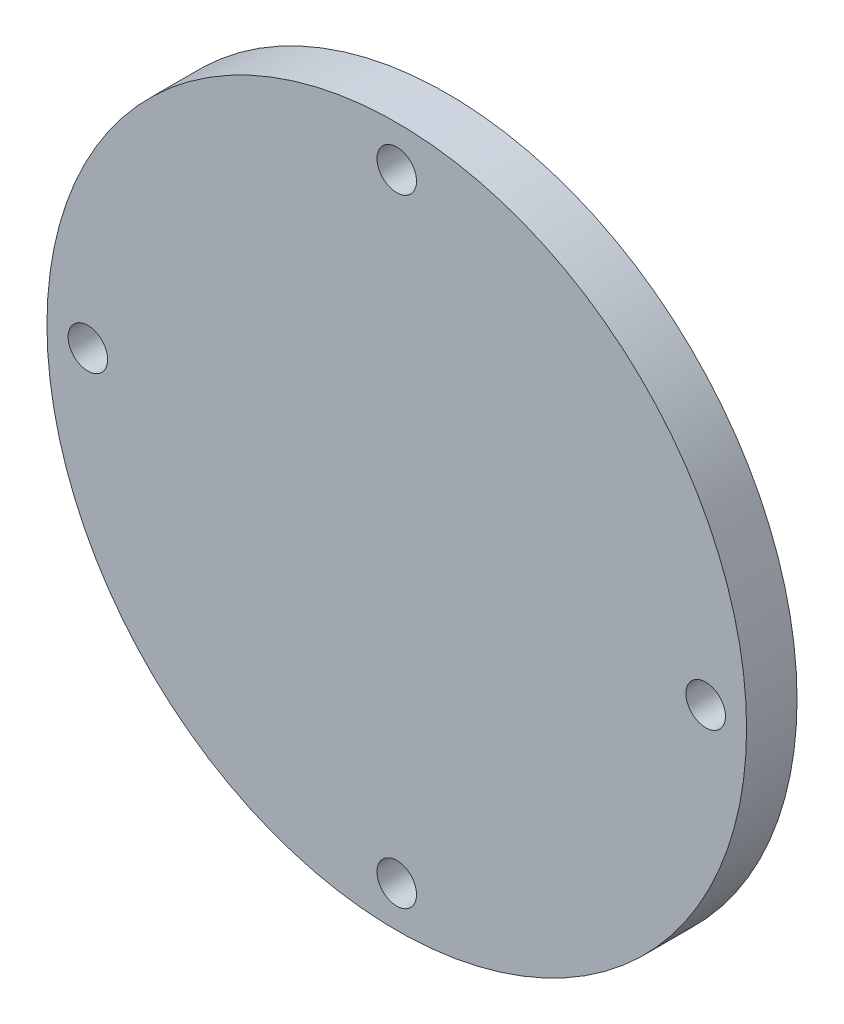
ISO-10303-21;
HEADER;
FILE_DESCRIPTION(('STEP AP214'),'2;1');
FILE_NAME('part.step','',(''),(''),'','','');
FILE_SCHEMA(('AUTOMOTIVE_DESIGN { 1 0 10303 214 1 1 1 1 }'));
ENDSEC;
DATA;
#1=APPLICATION_CONTEXT('core data for automotive mechanical design processes');
#2=APPLICATION_PROTOCOL_DEFINITION('international standard','automotive_design',2000,#1);
#3=PRODUCT_CONTEXT('',#1,'mechanical');
#4=PRODUCT('Part','Part','',(#3));
#5=PRODUCT_RELATED_PRODUCT_CATEGORY('part','',(#4));
#6=PRODUCT_DEFINITION_FORMATION('','',#4);
#7=PRODUCT_DEFINITION_CONTEXT('part definition',#1,'design');
#8=PRODUCT_DEFINITION('design','',#6,#7);
#9=PRODUCT_DEFINITION_SHAPE('','',#8);
#10=(LENGTH_UNIT() NAMED_UNIT(*) SI_UNIT(.MILLI.,.METRE.));
#11=(NAMED_UNIT(*) PLANE_ANGLE_UNIT() SI_UNIT($,.RADIAN.));
#12=(NAMED_UNIT(*) SI_UNIT($,.STERADIAN.) SOLID_ANGLE_UNIT());
#13=UNCERTAINTY_MEASURE_WITH_UNIT(LENGTH_MEASURE(1.E-05),#10,'distance_accuracy_value','');
#14=(GEOMETRIC_REPRESENTATION_CONTEXT(3) GLOBAL_UNCERTAINTY_ASSIGNED_CONTEXT((#13)) GLOBAL_UNIT_ASSIGNED_CONTEXT((#10,
#11,#12)) REPRESENTATION_CONTEXT('',''));
#15=CARTESIAN_POINT('',(0.,0.,0.));
#16=DIRECTION('',(0.,0.,1.));
#17=DIRECTION('',(1.,0.,0.));
#18=AXIS2_PLACEMENT_3D('',#15,#16,#17);
#19=CARTESIAN_POINT('',(0.,0.,3.7));
#20=DIRECTION('',(0.,0.,1.));
#21=DIRECTION('',(1.,0.,0.));
#22=AXIS2_PLACEMENT_3D('',#19,#20,#21);
#23=PLANE('',#22);
#24=CARTESIAN_POINT('',(2.37246156974391E-13,22.65,3.7));
#25=DIRECTION('',(0.,0.,1.));
#26=DIRECTION('',(1.,0.,0.));
#27=AXIS2_PLACEMENT_3D('',#24,#25,#26);
#28=CIRCLE('',#27,1.45);
#29=CARTESIAN_POINT('',(1.45000000000024,22.65,3.7));
#30=VERTEX_POINT('',#29);
#31=EDGE_CURVE('E70',#30,#30,#28,.T.);
#32=ORIENTED_EDGE('',*,*,#31,.F.);
#33=EDGE_LOOP('',(#32));
#34=FACE_BOUND('',#33,.T.);
#35=CARTESIAN_POINT('',(0.,-22.65,3.7));
#36=DIRECTION('',(0.,0.,1.));
#37=DIRECTION('',(1.,0.,0.));
#38=AXIS2_PLACEMENT_3D('',#35,#36,#37);
#39=CIRCLE('',#38,1.45);
#40=CARTESIAN_POINT('',(1.44999999999992,-22.65,3.7));
#41=VERTEX_POINT('',#40);
#42=EDGE_CURVE('E56',#41,#41,#39,.T.);
#43=ORIENTED_EDGE('',*,*,#42,.F.);
#44=EDGE_LOOP('',(#43));
#45=FACE_BOUND('',#44,.T.);
#46=CARTESIAN_POINT('',(0.,0.,3.7));
#47=DIRECTION('',(0.,0.,1.));
#48=DIRECTION('',(1.,0.,0.));
#49=AXIS2_PLACEMENT_3D('',#46,#47,#48);
#50=CIRCLE('',#49,25.65);
#51=CARTESIAN_POINT('',(25.65,0.,3.7));
#52=VERTEX_POINT('',#51);
#53=EDGE_CURVE('E10',#52,#52,#50,.T.);
#54=ORIENTED_EDGE('',*,*,#53,.T.);
#55=EDGE_LOOP('',(#54));
#56=FACE_BOUND('',#55,.T.);
#57=CARTESIAN_POINT('',(22.65,0.,3.7));
#58=DIRECTION('',(0.,0.,1.));
#59=DIRECTION('',(1.,0.,0.));
#60=AXIS2_PLACEMENT_3D('',#57,#58,#59);
#61=CIRCLE('',#60,1.45);
#62=CARTESIAN_POINT('',(24.1,0.,3.7));
#63=VERTEX_POINT('',#62);
#64=EDGE_CURVE('E62',#63,#63,#61,.T.);
#65=ORIENTED_EDGE('',*,*,#64,.F.);
#66=EDGE_LOOP('',(#65));
#67=FACE_BOUND('',#66,.T.);
#68=CARTESIAN_POINT('',(-22.65,1.58164104649594E-13,3.7));
#69=DIRECTION('',(0.,0.,1.));
#70=DIRECTION('',(1.,0.,0.));
#71=AXIS2_PLACEMENT_3D('',#68,#69,#70);
#72=CIRCLE('',#71,1.45);
#73=CARTESIAN_POINT('',(-21.2,1.58164104649594E-13,3.7));
#74=VERTEX_POINT('',#73);
#75=EDGE_CURVE('E78',#74,#74,#72,.T.);
#76=ORIENTED_EDGE('',*,*,#75,.F.);
#77=EDGE_LOOP('',(#76));
#78=FACE_BOUND('',#77,.T.);
#79=ADVANCED_FACE('F43',(#34,#45,#56,#67,#78),#23,.T.);
#80=CARTESIAN_POINT('',(0.,0.,0.));
#81=DIRECTION('',(0.,0.,1.));
#82=DIRECTION('',(1.,0.,0.));
#83=AXIS2_PLACEMENT_3D('',#80,#81,#82);
#84=PLANE('',#83);
#85=CARTESIAN_POINT('',(0.,0.,0.));
#86=DIRECTION('',(0.,0.,1.));
#87=DIRECTION('',(1.,0.,0.));
#88=AXIS2_PLACEMENT_3D('',#85,#86,#87);
#89=CIRCLE('',#88,25.65);
#90=CARTESIAN_POINT('',(25.65,0.,0.));
#91=VERTEX_POINT('',#90);
#92=EDGE_CURVE('E47',#91,#91,#89,.T.);
#93=ORIENTED_EDGE('',*,*,#92,.F.);
#94=EDGE_LOOP('',(#93));
#95=FACE_BOUND('',#94,.T.);
#96=CARTESIAN_POINT('',(0.,-22.65,0.));
#97=DIRECTION('',(0.,0.,1.));
#98=DIRECTION('',(1.,0.,0.));
#99=AXIS2_PLACEMENT_3D('',#96,#97,#98);
#100=CIRCLE('',#99,1.45);
#101=CARTESIAN_POINT('',(1.44999999999992,-22.65,0.));
#102=VERTEX_POINT('',#101);
#103=EDGE_CURVE('E58',#102,#102,#100,.T.);
#104=ORIENTED_EDGE('',*,*,#103,.T.);
#105=EDGE_LOOP('',(#104));
#106=FACE_BOUND('',#105,.T.);
#107=CARTESIAN_POINT('',(22.65,0.,0.));
#108=DIRECTION('',(0.,0.,1.));
#109=DIRECTION('',(1.,0.,0.));
#110=AXIS2_PLACEMENT_3D('',#107,#108,#109);
#111=CIRCLE('',#110,1.45);
#112=CARTESIAN_POINT('',(24.1,0.,0.));
#113=VERTEX_POINT('',#112);
#114=EDGE_CURVE('E66',#113,#113,#111,.T.);
#115=ORIENTED_EDGE('',*,*,#114,.T.);
#116=EDGE_LOOP('',(#115));
#117=FACE_BOUND('',#116,.T.);
#118=CARTESIAN_POINT('',(2.37246156974391E-13,22.65,0.));
#119=DIRECTION('',(0.,0.,1.));
#120=DIRECTION('',(1.,0.,0.));
#121=AXIS2_PLACEMENT_3D('',#118,#119,#120);
#122=CIRCLE('',#121,1.45);
#123=CARTESIAN_POINT('',(1.45000000000024,22.65,0.));
#124=VERTEX_POINT('',#123);
#125=EDGE_CURVE('E74',#124,#124,#122,.T.);
#126=ORIENTED_EDGE('',*,*,#125,.T.);
#127=EDGE_LOOP('',(#126));
#128=FACE_BOUND('',#127,.T.);
#129=CARTESIAN_POINT('',(-22.65,1.58164104649594E-13,0.));
#130=DIRECTION('',(0.,0.,1.));
#131=DIRECTION('',(1.,0.,0.));
#132=AXIS2_PLACEMENT_3D('',#129,#130,#131);
#133=CIRCLE('',#132,1.45);
#134=CARTESIAN_POINT('',(-21.2,1.58164104649594E-13,0.));
#135=VERTEX_POINT('',#134);
#136=EDGE_CURVE('E82',#135,#135,#133,.T.);
#137=ORIENTED_EDGE('',*,*,#136,.T.);
#138=EDGE_LOOP('',(#137));
#139=FACE_BOUND('',#138,.T.);
#140=ADVANCED_FACE('F94',(#95,#106,#117,#128,#139),#84,.F.);
#141=CARTESIAN_POINT('',(0.,0.,3.7));
#142=DIRECTION('',(0.,0.,-1.));
#143=DIRECTION('',(-1.,0.,0.));
#144=AXIS2_PLACEMENT_3D('',#141,#142,#143);
#145=CYLINDRICAL_SURFACE('',#144,25.65);
#146=ORIENTED_EDGE('',*,*,#53,.F.);
#147=EDGE_LOOP('',(#146));
#148=FACE_BOUND('',#147,.T.);
#149=ORIENTED_EDGE('',*,*,#92,.T.);
#150=EDGE_LOOP('',(#149));
#151=FACE_BOUND('',#150,.T.);
#152=ADVANCED_FACE('F45',(#148,#151),#145,.T.);
#153=CARTESIAN_POINT('',(0.,-22.65,3.7));
#154=DIRECTION('',(0.,0.,-1.));
#155=DIRECTION('',(-1.,0.,0.));
#156=AXIS2_PLACEMENT_3D('',#153,#154,#155);
#157=CYLINDRICAL_SURFACE('',#156,1.45);
#158=ORIENTED_EDGE('',*,*,#42,.T.);
#159=EDGE_LOOP('',(#158));
#160=FACE_BOUND('',#159,.T.);
#161=ORIENTED_EDGE('',*,*,#103,.F.);
#162=EDGE_LOOP('',(#161));
#163=FACE_BOUND('',#162,.T.);
#164=ADVANCED_FACE('F104',(#160,#163),#157,.F.);
#165=CARTESIAN_POINT('',(22.65,0.,3.7));
#166=DIRECTION('',(0.,0.,-1.));
#167=DIRECTION('',(-1.,0.,0.));
#168=AXIS2_PLACEMENT_3D('',#165,#166,#167);
#169=CYLINDRICAL_SURFACE('',#168,1.45);
#170=ORIENTED_EDGE('',*,*,#64,.T.);
#171=EDGE_LOOP('',(#170));
#172=FACE_BOUND('',#171,.T.);
#173=ORIENTED_EDGE('',*,*,#114,.F.);
#174=EDGE_LOOP('',(#173));
#175=FACE_BOUND('',#174,.T.);
#176=ADVANCED_FACE('F107',(#172,#175),#169,.F.);
#177=CARTESIAN_POINT('',(2.37246156974391E-13,22.65,3.7));
#178=DIRECTION('',(0.,0.,-1.));
#179=DIRECTION('',(-1.,0.,0.));
#180=AXIS2_PLACEMENT_3D('',#177,#178,#179);
#181=CYLINDRICAL_SURFACE('',#180,1.45);
#182=ORIENTED_EDGE('',*,*,#31,.T.);
#183=EDGE_LOOP('',(#182));
#184=FACE_BOUND('',#183,.T.);
#185=ORIENTED_EDGE('',*,*,#125,.F.);
#186=EDGE_LOOP('',(#185));
#187=FACE_BOUND('',#186,.T.);
#188=ADVANCED_FACE('F111',(#184,#187),#181,.F.);
#189=CARTESIAN_POINT('',(-22.65,1.58164104649594E-13,3.7));
#190=DIRECTION('',(0.,0.,-1.));
#191=DIRECTION('',(-1.,0.,0.));
#192=AXIS2_PLACEMENT_3D('',#189,#190,#191);
#193=CYLINDRICAL_SURFACE('',#192,1.45);
#194=ORIENTED_EDGE('',*,*,#75,.T.);
#195=EDGE_LOOP('',(#194));
#196=FACE_BOUND('',#195,.T.);
#197=ORIENTED_EDGE('',*,*,#136,.F.);
#198=EDGE_LOOP('',(#197));
#199=FACE_BOUND('',#198,.T.);
#200=ADVANCED_FACE('F90',(#196,#199),#193,.F.);
#201=CLOSED_SHELL('',(#79,#140,#152,#164,#176,#188,#200));
#202=MANIFOLD_SOLID_BREP('B2',#201);
#203=ADVANCED_BREP_SHAPE_REPRESENTATION('',(#18,#202),#14);
#204=SHAPE_DEFINITION_REPRESENTATION(#9,#203);
ENDSEC;
END-ISO-10303-21;
